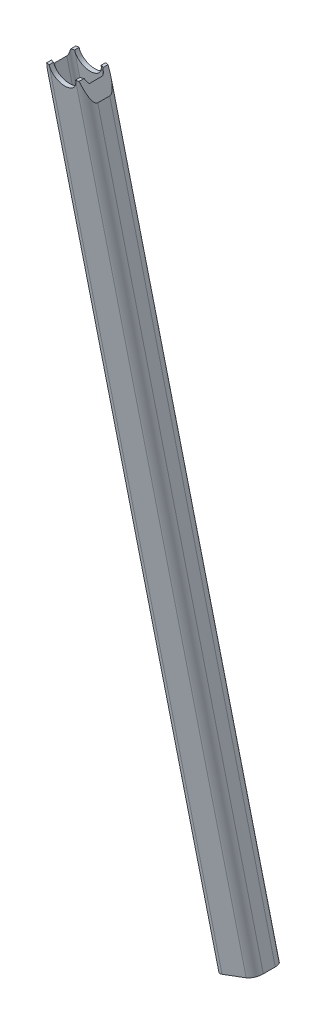
ISO-10303-21;
HEADER;
FILE_DESCRIPTION(('STEP AP214'),'2;1');
FILE_NAME('part.step','',(''),(''),'','','');
FILE_SCHEMA(('AUTOMOTIVE_DESIGN { 1 0 10303 214 1 1 1 1 }'));
ENDSEC;
DATA;
#1=APPLICATION_CONTEXT('core data for automotive mechanical design processes');
#2=APPLICATION_PROTOCOL_DEFINITION('international standard','automotive_design',2000,#1);
#3=PRODUCT_CONTEXT('',#1,'mechanical');
#4=PRODUCT('Part','Part','',(#3));
#5=PRODUCT_RELATED_PRODUCT_CATEGORY('part','',(#4));
#6=PRODUCT_DEFINITION_FORMATION('','',#4);
#7=PRODUCT_DEFINITION_CONTEXT('part definition',#1,'design');
#8=PRODUCT_DEFINITION('design','',#6,#7);
#9=PRODUCT_DEFINITION_SHAPE('','',#8);
#10=(LENGTH_UNIT() NAMED_UNIT(*) SI_UNIT(.MILLI.,.METRE.));
#11=(NAMED_UNIT(*) PLANE_ANGLE_UNIT() SI_UNIT($,.RADIAN.));
#12=(NAMED_UNIT(*) SI_UNIT($,.STERADIAN.) SOLID_ANGLE_UNIT());
#13=UNCERTAINTY_MEASURE_WITH_UNIT(LENGTH_MEASURE(1.E-05),#10,'distance_accuracy_value','');
#14=(GEOMETRIC_REPRESENTATION_CONTEXT(3) GLOBAL_UNCERTAINTY_ASSIGNED_CONTEXT((#13)) GLOBAL_UNIT_ASSIGNED_CONTEXT((#10,
#11,#12)) REPRESENTATION_CONTEXT('',''));
#15=CARTESIAN_POINT('',(0.,0.,0.));
#16=DIRECTION('',(0.,0.,1.));
#17=DIRECTION('',(1.,0.,0.));
#18=AXIS2_PLACEMENT_3D('',#15,#16,#17);
#19=CARTESIAN_POINT('',(0.,0.,0.));
#20=DIRECTION('',(0.,1.,0.));
#21=DIRECTION('',(0.,0.,-1.));
#22=AXIS2_PLACEMENT_3D('',#19,#20,#21);
#23=PLANE('',#22);
#24=CARTESIAN_POINT('',(9.,0.,-4.07747594806573));
#25=DIRECTION('',(0.,-1.,0.));
#26=DIRECTION('',(0.,0.,1.));
#27=AXIS2_PLACEMENT_3D('',#24,#25,#26);
#28=ELLIPSE('',#27,6.1162139220986,6.);
#29=CARTESIAN_POINT('',(8.99999999999999,0.,-10.1936898701643));
#30=VERTEX_POINT('',#29);
#31=CARTESIAN_POINT('',(10.980762113533,0.,-9.8507936254523));
#32=VERTEX_POINT('',#31);
#33=EDGE_CURVE('E214',#30,#32,#28,.T.);
#34=ORIENTED_EDGE('',*,*,#33,.F.);
#35=DIRECTION('',(0.,0.,-1.));
#36=VECTOR('',#35,1.);
#37=CARTESIAN_POINT('',(9.,0.,10.1936898701643));
#38=LINE('',#37,#36);
#39=CARTESIAN_POINT('',(9.00000000000003,0.,-7.13558290911504));
#40=VERTEX_POINT('',#39);
#41=EDGE_CURVE('E197',#30,#40,#38,.F.);
#42=ORIENTED_EDGE('',*,*,#41,.T.);
#43=CARTESIAN_POINT('',(9.,0.,-4.07747594806573));
#44=DIRECTION('',(0.,-1.,0.));
#45=DIRECTION('',(0.,0.,1.));
#46=AXIS2_PLACEMENT_3D('',#43,#44,#45);
#47=ELLIPSE('',#46,3.0581069610493,3.);
#48=CARTESIAN_POINT('',(10.980762113533,0.,-6.37424377446214));
#49=VERTEX_POINT('',#48);
#50=EDGE_CURVE('E202',#40,#49,#47,.T.);
#51=ORIENTED_EDGE('',*,*,#50,.T.);
#52=DIRECTION('',(0.,0.,1.));
#53=VECTOR('',#52,1.);
#54=CARTESIAN_POINT('',(10.980762113533,0.,0.));
#55=LINE('',#54,#53);
#56=EDGE_CURVE('E310',#32,#49,#55,.T.);
#57=ORIENTED_EDGE('',*,*,#56,.F.);
#58=EDGE_LOOP('',(#34,#42,#51,#57));
#59=FACE_BOUND('',#58,.T.);
#60=ADVANCED_FACE('F43',(#59),#23,.T.);
#61=CARTESIAN_POINT('',(-9.,0.,4.07747594806573));
#62=DIRECTION('',(0.,-1.,0.));
#63=DIRECTION('',(0.,0.,1.));
#64=AXIS2_PLACEMENT_3D('',#61,#62,#63);
#65=ELLIPSE('',#64,6.1162139220986,6.);
#66=CARTESIAN_POINT('',(-9.,0.,10.1936898701643));
#67=VERTEX_POINT('',#66);
#68=CARTESIAN_POINT('',(-10.980762113533,0.,9.8507936254523));
#69=VERTEX_POINT('',#68);
#70=EDGE_CURVE('E249',#67,#69,#65,.T.);
#71=ORIENTED_EDGE('',*,*,#70,.F.);
#72=DIRECTION('',(0.,0.,-1.));
#73=VECTOR('',#72,1.);
#74=CARTESIAN_POINT('',(-9.,0.,10.1936898701643));
#75=LINE('',#74,#73);
#76=CARTESIAN_POINT('',(-8.99999999999999,0.,7.13558290911504));
#77=VERTEX_POINT('',#76);
#78=EDGE_CURVE('E220',#67,#77,#75,.T.);
#79=ORIENTED_EDGE('',*,*,#78,.T.);
#80=CARTESIAN_POINT('',(-9.,0.,4.07747594806573));
#81=DIRECTION('',(0.,-1.,0.));
#82=DIRECTION('',(0.,0.,1.));
#83=AXIS2_PLACEMENT_3D('',#80,#81,#82);
#84=ELLIPSE('',#83,3.0581069610493,3.);
#85=CARTESIAN_POINT('',(-10.980762113533,0.,6.37424377446214));
#86=VERTEX_POINT('',#85);
#87=EDGE_CURVE('E323',#77,#86,#84,.T.);
#88=ORIENTED_EDGE('',*,*,#87,.T.);
#89=DIRECTION('',(0.,0.,-1.));
#90=VECTOR('',#89,1.);
#91=CARTESIAN_POINT('',(-10.980762113533,0.,0.));
#92=LINE('',#91,#90);
#93=EDGE_CURVE('E286',#69,#86,#92,.T.);
#94=ORIENTED_EDGE('',*,*,#93,.F.);
#95=EDGE_LOOP('',(#71,#79,#88,#94));
#96=FACE_BOUND('',#95,.T.);
#97=ADVANCED_FACE('F394',(#96),#23,.T.);
#98=CARTESIAN_POINT('',(0.,0.,10.1936898701643));
#99=DIRECTION('',(0.,0.,-1.));
#100=DIRECTION('',(1.,0.,0.));
#101=AXIS2_PLACEMENT_3D('',#98,#99,#100);
#102=CYLINDRICAL_SURFACE('',#101,9.);
#103=CARTESIAN_POINT('',(0.,0.,7.13558290911504));
#104=DIRECTION('',(0.,0.194012574418143,-0.980999042286813));
#105=DIRECTION('',(0.,-0.980999042286813,-0.194012574418143));
#106=AXIS2_PLACEMENT_3D('',#103,#104,#105);
#107=ELLIPSE('',#106,9.1743208831479,9.);
#108=CARTESIAN_POINT('',(9.,0.,7.13558290911504));
#109=VERTEX_POINT('',#108);
#110=EDGE_CURVE('E201',#109,#77,#107,.T.);
#111=ORIENTED_EDGE('',*,*,#110,.T.);
#112=ORIENTED_EDGE('',*,*,#78,.F.);
#113=CARTESIAN_POINT('',(0.,0.,10.1936898701643));
#114=DIRECTION('',(0.,0.194012574418143,-0.980999042286813));
#115=DIRECTION('',(0.,-0.980999042286813,-0.194012574418143));
#116=AXIS2_PLACEMENT_3D('',#113,#114,#115);
#117=ELLIPSE('',#116,9.1743208831479,9.);
#118=CARTESIAN_POINT('',(9.,0.,10.1936898701643));
#119=VERTEX_POINT('',#118);
#120=EDGE_CURVE('E186',#119,#67,#117,.T.);
#121=ORIENTED_EDGE('',*,*,#120,.F.);
#122=EDGE_CURVE('E212',#109,#119,#38,.F.);
#123=ORIENTED_EDGE('',*,*,#122,.F.);
#124=EDGE_LOOP('',(#111,#112,#121,#123));
#125=FACE_BOUND('',#124,.T.);
#126=ADVANCED_FACE('F388',(#125),#102,.F.);
#127=CARTESIAN_POINT('',(-9.,0.,-4.07747594806573));
#128=DIRECTION('',(0.,-1.,0.));
#129=DIRECTION('',(0.,0.,-1.));
#130=AXIS2_PLACEMENT_3D('',#127,#128,#129);
#131=ELLIPSE('',#130,3.0581069610493,3.);
#132=CARTESIAN_POINT('',(-10.980762113533,0.,-6.37424377446214));
#133=VERTEX_POINT('',#132);
#134=CARTESIAN_POINT('',(-9.,0.,-7.13558290911504));
#135=VERTEX_POINT('',#134);
#136=EDGE_CURVE('E213',#133,#135,#131,.T.);
#137=ORIENTED_EDGE('',*,*,#136,.T.);
#138=CARTESIAN_POINT('',(-8.99999999999995,0.,-10.1936898701643));
#139=VERTEX_POINT('',#138);
#140=EDGE_CURVE('E196',#135,#139,#75,.T.);
#141=ORIENTED_EDGE('',*,*,#140,.T.);
#142=CARTESIAN_POINT('',(-9.,0.,-4.07747594806573));
#143=DIRECTION('',(0.,-1.,0.));
#144=DIRECTION('',(0.,0.,-1.));
#145=AXIS2_PLACEMENT_3D('',#142,#143,#144);
#146=ELLIPSE('',#145,6.1162139220986,6.);
#147=CARTESIAN_POINT('',(-10.980762113533,0.,-9.8507936254523));
#148=VERTEX_POINT('',#147);
#149=EDGE_CURVE('E243',#148,#139,#146,.T.);
#150=ORIENTED_EDGE('',*,*,#149,.F.);
#151=DIRECTION('',(0.,0.,-1.));
#152=VECTOR('',#151,1.);
#153=CARTESIAN_POINT('',(-10.980762113533,0.,0.));
#154=LINE('',#153,#152);
#155=EDGE_CURVE('E281',#133,#148,#154,.T.);
#156=ORIENTED_EDGE('',*,*,#155,.F.);
#157=EDGE_LOOP('',(#137,#141,#150,#156));
#158=FACE_BOUND('',#157,.T.);
#159=ADVANCED_FACE('F369',(#158),#23,.T.);
#160=CARTESIAN_POINT('',(9.,0.,4.07747594806573));
#161=DIRECTION('',(0.,-1.,0.));
#162=DIRECTION('',(0.,0.,-1.));
#163=AXIS2_PLACEMENT_3D('',#160,#161,#162);
#164=ELLIPSE('',#163,3.0581069610493,3.);
#165=CARTESIAN_POINT('',(10.980762113533,0.,6.37424377446214));
#166=VERTEX_POINT('',#165);
#167=EDGE_CURVE('E208',#166,#109,#164,.T.);
#168=ORIENTED_EDGE('',*,*,#167,.T.);
#169=ORIENTED_EDGE('',*,*,#122,.T.);
#170=CARTESIAN_POINT('',(9.,0.,4.07747594806573));
#171=DIRECTION('',(0.,-1.,0.));
#172=DIRECTION('',(0.,0.,-1.));
#173=AXIS2_PLACEMENT_3D('',#170,#171,#172);
#174=ELLIPSE('',#173,6.1162139220986,6.);
#175=CARTESIAN_POINT('',(10.980762113533,0.,9.8507936254523));
#176=VERTEX_POINT('',#175);
#177=EDGE_CURVE('E250',#176,#119,#174,.T.);
#178=ORIENTED_EDGE('',*,*,#177,.F.);
#179=DIRECTION('',(0.,0.,1.));
#180=VECTOR('',#179,1.);
#181=CARTESIAN_POINT('',(10.980762113533,0.,0.));
#182=LINE('',#181,#180);
#183=EDGE_CURVE('E302',#166,#176,#182,.T.);
#184=ORIENTED_EDGE('',*,*,#183,.F.);
#185=EDGE_LOOP('',(#168,#169,#178,#184));
#186=FACE_BOUND('',#185,.T.);
#187=ADVANCED_FACE('F317',(#186),#23,.T.);
#188=CARTESIAN_POINT('',(-15.,21.5601065899177,-5.92973893450527));
#189=DIRECTION('',(-1.,0.,0.));
#190=DIRECTION('',(0.,0.,-1.));
#191=AXIS2_PLACEMENT_3D('',#188,#189,#190);
#192=PLANE('',#191);
#193=DIRECTION('',(0.,0.980999042286813,0.194012574418143));
#194=VECTOR('',#193,1.);
#195=CARTESIAN_POINT('',(-15.,-1.16407544650886,-4.30769561644346));
#196=LINE('',#195,#194);
#197=CARTESIAN_POINT('',(-15.,-597.146812792209,-122.175440840404));
#198=VERTEX_POINT('',#197);
#199=CARTESIAN_POINT('',(-15.,-15.,-7.04403196986183));
#200=VERTEX_POINT('',#199);
#201=EDGE_CURVE('E254',#198,#200,#196,.T.);
#202=ORIENTED_EDGE('',*,*,#201,.F.);
#203=DIRECTION('',(0.,0.,1.));
#204=VECTOR('',#203,1.);
#205=CARTESIAN_POINT('',(-15.,-597.146812792209,-5.92973893450527));
#206=LINE('',#205,#204);
#207=CARTESIAN_POINT('',(-15.,-597.146812792209,-114.020488944272));
#208=VERTEX_POINT('',#207);
#209=EDGE_CURVE('E230',#198,#208,#206,.T.);
#210=ORIENTED_EDGE('',*,*,#209,.T.);
#211=DIRECTION('',(0.,0.980999042286813,0.194012574418143));
#212=VECTOR('',#211,1.);
#213=CARTESIAN_POINT('',(-15.,18.8439305480637,7.80424765751012));
#214=LINE('',#213,#212);
#215=CARTESIAN_POINT('',(-15.,-15.,1.11091992626965));
#216=VERTEX_POINT('',#215);
#217=EDGE_CURVE('E258',#216,#208,#214,.F.);
#218=ORIENTED_EDGE('',*,*,#217,.F.);
#219=DIRECTION('',(0.,0.,1.));
#220=VECTOR('',#219,1.);
#221=CARTESIAN_POINT('',(-15.,-15.,-5.92973893450527));
#222=LINE('',#221,#220);
#223=EDGE_CURVE('E279',#200,#216,#222,.T.);
#224=ORIENTED_EDGE('',*,*,#223,.F.);
#225=EDGE_LOOP('',(#202,#210,#218,#224));
#226=FACE_BOUND('',#225,.T.);
#227=ADVANCED_FACE('F437',(#226),#192,.T.);
#228=CARTESIAN_POINT('',(15.,21.5601065899177,-5.92973893450527));
#229=DIRECTION('',(1.,0.,0.));
#230=DIRECTION('',(0.,0.,1.));
#231=AXIS2_PLACEMENT_3D('',#228,#229,#230);
#232=PLANE('',#231);
#233=DIRECTION('',(0.,-0.980999042286813,-0.194012574418143));
#234=VECTOR('',#233,1.);
#235=CARTESIAN_POINT('',(15.,18.8439305480637,7.80424765751011));
#236=LINE('',#235,#234);
#237=CARTESIAN_POINT('',(15.,-584.412568305921,-111.502032300018));
#238=VERTEX_POINT('',#237);
#239=CARTESIAN_POINT('',(15.,-15.,1.11091992626964));
#240=VERTEX_POINT('',#239);
#241=EDGE_CURVE('E267',#238,#240,#236,.F.);
#242=ORIENTED_EDGE('',*,*,#241,.F.);
#243=DIRECTION('',(0.,0.,-1.));
#244=VECTOR('',#243,1.);
#245=CARTESIAN_POINT('',(15.,-584.412568305921,-5.92973893450527));
#246=LINE('',#245,#244);
#247=CARTESIAN_POINT('',(15.,-584.412568305921,-119.656984196149));
#248=VERTEX_POINT('',#247);
#249=EDGE_CURVE('E228',#238,#248,#246,.T.);
#250=ORIENTED_EDGE('',*,*,#249,.T.);
#251=DIRECTION('',(0.,-0.980999042286813,-0.194012574418143));
#252=VECTOR('',#251,1.);
#253=CARTESIAN_POINT('',(15.,-585.576643752429,-119.887203864527));
#254=LINE('',#253,#252);
#255=CARTESIAN_POINT('',(15.,-15.,-7.04403196986182));
#256=VERTEX_POINT('',#255);
#257=EDGE_CURVE('E266',#256,#248,#254,.T.);
#258=ORIENTED_EDGE('',*,*,#257,.F.);
#259=DIRECTION('',(0.,0.,-1.));
#260=VECTOR('',#259,1.);
#261=CARTESIAN_POINT('',(15.,-15.,-5.92973893450527));
#262=LINE('',#261,#260);
#263=EDGE_CURVE('E299',#240,#256,#262,.T.);
#264=ORIENTED_EDGE('',*,*,#263,.F.);
#265=EDGE_LOOP('',(#242,#250,#258,#264));
#266=FACE_BOUND('',#265,.T.);
#267=ADVANCED_FACE('F410',(#266),#232,.T.);
#268=CARTESIAN_POINT('',(0.,1.94012574418143,-9.80999042286813));
#269=DIRECTION('',(0.,-0.194012574418143,0.980999042286813));
#270=DIRECTION('',(0.,0.980999042286813,0.194012574418143));
#271=AXIS2_PLACEMENT_3D('',#268,#269,#270);
#272=PLANE('',#271);
#273=DIRECTION('',(0.,-0.980999042286813,-0.194012574418143));
#274=VECTOR('',#273,1.);
#275=CARTESIAN_POINT('',(9.,0.,-10.1936898701643));
#276=LINE('',#275,#274);
#277=CARTESIAN_POINT('',(9.00000000000006,-586.959417203178,-126.276889447099));
#278=VERTEX_POINT('',#277);
#279=EDGE_CURVE('E278',#278,#30,#276,.F.);
#280=ORIENTED_EDGE('',*,*,#279,.F.);
#281=DIRECTION('',(0.917768734443844,0.389569714875973,0.0770453589049803));
#282=VECTOR('',#281,1.);
#283=CARTESIAN_POINT('',(220.206800266404,-497.307449477877,-108.546383799008));
#284=LINE('',#283,#282);
#285=CARTESIAN_POINT('',(-8.99999999999995,-594.599963894951,-127.787963433651));
#286=VERTEX_POINT('',#285);
#287=EDGE_CURVE('E235',#286,#278,#284,.T.);
#288=ORIENTED_EDGE('',*,*,#287,.F.);
#289=DIRECTION('',(0.,0.980999042286813,0.194012574418143));
#290=VECTOR('',#289,1.);
#291=CARTESIAN_POINT('',(-9.,-597.146812792209,-128.291654762502));
#292=LINE('',#291,#290);
#293=EDGE_CURVE('E271',#139,#286,#292,.F.);
#294=ORIENTED_EDGE('',*,*,#293,.F.);
#295=CARTESIAN_POINT('',(0.,0.,-10.1936898701643));
#296=DIRECTION('',(0.,0.194012574418143,-0.980999042286813));
#297=DIRECTION('',(0.,-0.980999042286813,-0.194012574418143));
#298=AXIS2_PLACEMENT_3D('',#295,#296,#297);
#299=ELLIPSE('',#298,9.1743208831479,9.);
#300=EDGE_CURVE('E223',#30,#139,#299,.T.);
#301=ORIENTED_EDGE('',*,*,#300,.F.);
#302=EDGE_LOOP('',(#280,#288,#294,#301));
#303=FACE_BOUND('',#302,.T.);
#304=ADVANCED_FACE('F411',(#303),#272,.F.);
#305=CARTESIAN_POINT('',(0.,-1.94012574418143,9.80999042286813));
#306=DIRECTION('',(0.,-0.194012574418143,0.980999042286813));
#307=DIRECTION('',(0.,0.980999042286813,0.194012574418143));
#308=AXIS2_PLACEMENT_3D('',#305,#306,#307);
#309=PLANE('',#308);
#310=ORIENTED_EDGE('',*,*,#120,.T.);
#311=DIRECTION('',(0.,0.980999042286813,0.194012574418143));
#312=VECTOR('',#311,1.);
#313=CARTESIAN_POINT('',(-9.,-1.94012574418143,9.80999042286813));
#314=LINE('',#313,#312);
#315=CARTESIAN_POINT('',(-8.99999999999998,-594.599963894951,-107.400583693323));
#316=VERTEX_POINT('',#315);
#317=EDGE_CURVE('E241',#316,#67,#314,.T.);
#318=ORIENTED_EDGE('',*,*,#317,.F.);
#319=DIRECTION('',(0.917768734443844,0.389569714875973,0.0770453589049803));
#320=VECTOR('',#319,1.);
#321=CARTESIAN_POINT('',(218.765212283359,-497.919367272031,-88.2800232864852));
#322=LINE('',#321,#320);
#323=CARTESIAN_POINT('',(9.00000000000006,-586.959417203178,-105.88950970677));
#324=VERTEX_POINT('',#323);
#325=EDGE_CURVE('E232',#316,#324,#322,.T.);
#326=ORIENTED_EDGE('',*,*,#325,.T.);
#327=DIRECTION('',(0.,-0.980999042286813,-0.194012574418143));
#328=VECTOR('',#327,1.);
#329=CARTESIAN_POINT('',(9.,-1.94012574418143,9.80999042286813));
#330=LINE('',#329,#328);
#331=EDGE_CURVE('E238',#119,#324,#330,.T.);
#332=ORIENTED_EDGE('',*,*,#331,.F.);
#333=EDGE_LOOP('',(#310,#318,#326,#332));
#334=FACE_BOUND('',#333,.T.);
#335=ADVANCED_FACE('F397',(#334),#309,.T.);
#336=CARTESIAN_POINT('',(212.485672321848,-500.584873843074,0.));
#337=DIRECTION('',(-0.390731128489275,0.92050485345244,0.));
#338=DIRECTION('',(-0.92050485345244,-0.390731128489275,0.));
#339=AXIS2_PLACEMENT_3D('',#336,#337,#338);
#340=PLANE('',#339);
#341=DIRECTION('',(0.,0.,1.));
#342=VECTOR('',#341,1.);
#343=CARTESIAN_POINT('',(-12.,-595.87338834358,-5.92973893450527));
#344=LINE('',#343,#342);
#345=CARTESIAN_POINT('',(-12.,-595.87338834358,-121.923595175978));
#346=VERTEX_POINT('',#345);
#347=CARTESIAN_POINT('',(-12.,-595.87338834358,-113.768643279847));
#348=VERTEX_POINT('',#347);
#349=EDGE_CURVE('E326',#346,#348,#344,.T.);
#350=ORIENTED_EDGE('',*,*,#349,.T.);
#351=CARTESIAN_POINT('',(-9.,-594.599963894951,-113.516797615421));
#352=DIRECTION('',(0.390731128489275,-0.92050485345244,0.));
#353=DIRECTION('',(0.821292711636287,0.348618072826102,0.4516012855519));
#354=AXIS2_PLACEMENT_3D('',#351,#352,#353);
#355=ELLIPSE('',#354,3.32220623235128,3.);
#356=CARTESIAN_POINT('',(-8.99999999999998,-594.599963894951,-110.458690654372));
#357=VERTEX_POINT('',#356);
#358=EDGE_CURVE('E331',#348,#357,#355,.F.);
#359=ORIENTED_EDGE('',*,*,#358,.T.);
#360=DIRECTION('',(0.917768734443844,0.389569714875973,0.0770453589049803));
#361=VECTOR('',#360,1.);
#362=CARTESIAN_POINT('',(218.981450480816,-497.827579602908,-91.3199773633636));
#363=LINE('',#362,#361);
#364=CARTESIAN_POINT('',(9.,-586.959417203178,-108.947616667819));
#365=VERTEX_POINT('',#364);
#366=EDGE_CURVE('E340',#357,#365,#363,.T.);
#367=ORIENTED_EDGE('',*,*,#366,.T.);
#368=CARTESIAN_POINT('',(9.,-586.959417203178,-112.005723628868));
#369=DIRECTION('',(0.390731128489275,-0.92050485345244,0.));
#370=DIRECTION('',(-0.821292711636287,-0.348618072826102,-0.4516012855519));
#371=AXIS2_PLACEMENT_3D('',#368,#369,#370);
#372=ELLIPSE('',#371,3.32220623235128,3.);
#373=CARTESIAN_POINT('',(12.,-585.685992754549,-111.753877964443));
#374=VERTEX_POINT('',#373);
#375=EDGE_CURVE('E337',#365,#374,#372,.F.);
#376=ORIENTED_EDGE('',*,*,#375,.T.);
#377=DIRECTION('',(0.,0.,-1.));
#378=VECTOR('',#377,1.);
#379=CARTESIAN_POINT('',(12.,-585.685992754549,-5.92973893450527));
#380=LINE('',#379,#378);
#381=CARTESIAN_POINT('',(12.,-585.685992754549,-119.908829860574));
#382=VERTEX_POINT('',#381);
#383=EDGE_CURVE('E204',#374,#382,#380,.T.);
#384=ORIENTED_EDGE('',*,*,#383,.T.);
#385=CARTESIAN_POINT('',(9.,-586.959417203178,-120.160675525));
#386=DIRECTION('',(0.390731128489275,-0.92050485345244,0.));
#387=DIRECTION('',(0.821292711636287,0.348618072826102,0.4516012855519));
#388=AXIS2_PLACEMENT_3D('',#385,#386,#387);
#389=ELLIPSE('',#388,3.32220623235128,3.);
#390=CARTESIAN_POINT('',(9.00000000000006,-586.959417203178,-123.218782486049));
#391=VERTEX_POINT('',#390);
#392=EDGE_CURVE('E345',#382,#391,#389,.F.);
#393=ORIENTED_EDGE('',*,*,#392,.T.);
#394=DIRECTION('',(0.917768734443844,0.389569714875973,0.0770453589049803));
#395=VECTOR('',#394,1.);
#396=CARTESIAN_POINT('',(219.990562068948,-497.399237147,-105.506429722129));
#397=LINE('',#396,#395);
#398=CARTESIAN_POINT('',(-8.99999999999995,-594.599963894951,-124.729856472602));
#399=VERTEX_POINT('',#398);
#400=EDGE_CURVE('E183',#399,#391,#397,.T.);
#401=ORIENTED_EDGE('',*,*,#400,.F.);
#402=CARTESIAN_POINT('',(-9.,-594.599963894951,-121.671749511553));
#403=DIRECTION('',(0.390731128489275,-0.92050485345244,0.));
#404=DIRECTION('',(-0.821292711636287,-0.348618072826102,-0.4516012855519));
#405=AXIS2_PLACEMENT_3D('',#402,#403,#404);
#406=ELLIPSE('',#405,3.32220623235128,3.);
#407=EDGE_CURVE('E347',#399,#346,#406,.F.);
#408=ORIENTED_EDGE('',*,*,#407,.T.);
#409=EDGE_LOOP('',(#350,#359,#367,#376,#384,#393,#401,#408));
#410=FACE_BOUND('',#409,.T.);
#411=ORIENTED_EDGE('',*,*,#209,.F.);
#412=CARTESIAN_POINT('',(-9.,-594.599963894951,-121.671749511553));
#413=DIRECTION('',(0.390731128489275,-0.92050485345244,0.));
#414=DIRECTION('',(-0.821292711636287,-0.348618072826102,-0.4516012855519));
#415=AXIS2_PLACEMENT_3D('',#412,#413,#414);
#416=ELLIPSE('',#415,6.64441246470257,6.);
#417=EDGE_CURVE('E259',#286,#198,#416,.F.);
#418=ORIENTED_EDGE('',*,*,#417,.F.);
#419=ORIENTED_EDGE('',*,*,#287,.T.);
#420=CARTESIAN_POINT('',(9.,-586.959417203178,-120.160675525));
#421=DIRECTION('',(0.390731128489275,-0.92050485345244,0.));
#422=DIRECTION('',(0.821292711636287,0.348618072826102,0.4516012855519));
#423=AXIS2_PLACEMENT_3D('',#420,#421,#422);
#424=ELLIPSE('',#423,6.64441246470257,6.);
#425=EDGE_CURVE('E262',#248,#278,#424,.F.);
#426=ORIENTED_EDGE('',*,*,#425,.F.);
#427=ORIENTED_EDGE('',*,*,#249,.F.);
#428=CARTESIAN_POINT('',(9.,-586.959417203178,-112.005723628868));
#429=DIRECTION('',(0.390731128489275,-0.92050485345244,0.));
#430=DIRECTION('',(-0.821292711636287,-0.348618072826102,-0.4516012855519));
#431=AXIS2_PLACEMENT_3D('',#428,#429,#430);
#432=ELLIPSE('',#431,6.64441246470257,6.);
#433=EDGE_CURVE('E264',#324,#238,#432,.F.);
#434=ORIENTED_EDGE('',*,*,#433,.F.);
#435=ORIENTED_EDGE('',*,*,#325,.F.);
#436=CARTESIAN_POINT('',(-9.,-594.599963894951,-113.516797615421));
#437=DIRECTION('',(0.390731128489275,-0.92050485345244,0.));
#438=DIRECTION('',(0.821292711636287,0.348618072826102,0.4516012855519));
#439=AXIS2_PLACEMENT_3D('',#436,#437,#438);
#440=ELLIPSE('',#439,6.64441246470257,6.);
#441=EDGE_CURVE('E263',#208,#316,#440,.F.);
#442=ORIENTED_EDGE('',*,*,#441,.F.);
#443=EDGE_LOOP('',(#411,#418,#419,#426,#427,#434,#435,#442));
#444=FACE_BOUND('',#443,.T.);
#445=ADVANCED_FACE('F372',(#410,#444),#340,.F.);
#446=CARTESIAN_POINT('',(-9.,-0.776050297672572,3.92399616914725));
#447=DIRECTION('',(0.,0.980999042286813,0.194012574418143));
#448=DIRECTION('',(0.,0.194012574418143,-0.980999042286813));
#449=AXIS2_PLACEMENT_3D('',#446,#447,#448);
#450=CYLINDRICAL_SURFACE('',#449,6.);
#451=ORIENTED_EDGE('',*,*,#217,.T.);
#452=ORIENTED_EDGE('',*,*,#441,.T.);
#453=ORIENTED_EDGE('',*,*,#317,.T.);
#454=ORIENTED_EDGE('',*,*,#70,.T.);
#455=CARTESIAN_POINT('',(-9.,7.39230484541259,5.53945504500648));
#456=DIRECTION('',(-0.965925826289066,0.258819045102528,0.));
#457=DIRECTION('',(0.253558845971762,0.94629449587512,0.200585739039248));
#458=AXIS2_PLACEMENT_3D('',#455,#456,#457);
#459=ELLIPSE('',#458,23.6312359458545,6.);
#460=EDGE_CURVE('E285',#216,#69,#459,.T.);
#461=ORIENTED_EDGE('',*,*,#460,.F.);
#462=EDGE_LOOP('',(#451,#452,#453,#454,#461));
#463=FACE_BOUND('',#462,.T.);
#464=ADVANCED_FACE('F393',(#463),#450,.T.);
#465=CARTESIAN_POINT('',(9.,-0.776050297672572,3.92399616914725));
#466=DIRECTION('',(0.,-0.980999042286813,-0.194012574418143));
#467=DIRECTION('',(0.,-0.194012574418143,0.980999042286813));
#468=AXIS2_PLACEMENT_3D('',#465,#466,#467);
#469=CYLINDRICAL_SURFACE('',#468,6.);
#470=ORIENTED_EDGE('',*,*,#177,.T.);
#471=ORIENTED_EDGE('',*,*,#331,.T.);
#472=ORIENTED_EDGE('',*,*,#433,.T.);
#473=ORIENTED_EDGE('',*,*,#241,.T.);
#474=CARTESIAN_POINT('',(9.,7.39230484541259,5.53945504500648));
#475=DIRECTION('',(0.965925826289066,0.258819045102528,0.));
#476=DIRECTION('',(0.253558845971762,-0.94629449587512,-0.200585739039248));
#477=AXIS2_PLACEMENT_3D('',#474,#475,#476);
#478=ELLIPSE('',#477,23.6312359458545,6.);
#479=EDGE_CURVE('E11',#176,#240,#478,.T.);
#480=ORIENTED_EDGE('',*,*,#479,.F.);
#481=EDGE_LOOP('',(#470,#471,#472,#473,#480));
#482=FACE_BOUND('',#481,.T.);
#483=ADVANCED_FACE('F405',(#482),#469,.T.);
#484=CARTESIAN_POINT('',(9.,20.3960311434088,-0.0437446807843925));
#485=DIRECTION('',(0.,0.980999042286813,0.194012574418143));
#486=DIRECTION('',(0.,0.194012574418143,-0.980999042286813));
#487=AXIS2_PLACEMENT_3D('',#484,#485,#486);
#488=CYLINDRICAL_SURFACE('',#487,6.);
#489=ORIENTED_EDGE('',*,*,#257,.T.);
#490=ORIENTED_EDGE('',*,*,#425,.T.);
#491=ORIENTED_EDGE('',*,*,#279,.T.);
#492=ORIENTED_EDGE('',*,*,#33,.T.);
#493=CARTESIAN_POINT('',(9.,7.39230484541259,-2.61549685112499));
#494=DIRECTION('',(0.965925826289066,0.258819045102528,0.));
#495=DIRECTION('',(-0.253558845971762,0.94629449587512,0.200585739039248));
#496=AXIS2_PLACEMENT_3D('',#493,#494,#495);
#497=ELLIPSE('',#496,23.6312359458545,6.);
#498=EDGE_CURVE('E305',#256,#32,#497,.T.);
#499=ORIENTED_EDGE('',*,*,#498,.F.);
#500=EDGE_LOOP('',(#489,#490,#491,#492,#499));
#501=FACE_BOUND('',#500,.T.);
#502=ADVANCED_FACE('F407',(#501),#488,.T.);
#503=CARTESIAN_POINT('',(-9.,20.3960311434088,-0.0437446807843925));
#504=DIRECTION('',(0.,-0.980999042286813,-0.194012574418143));
#505=DIRECTION('',(0.,-0.194012574418143,0.980999042286813));
#506=AXIS2_PLACEMENT_3D('',#503,#504,#505);
#507=CYLINDRICAL_SURFACE('',#506,6.);
#508=ORIENTED_EDGE('',*,*,#149,.T.);
#509=ORIENTED_EDGE('',*,*,#293,.T.);
#510=ORIENTED_EDGE('',*,*,#417,.T.);
#511=ORIENTED_EDGE('',*,*,#201,.T.);
#512=CARTESIAN_POINT('',(-9.,7.39230484541259,-2.61549685112499));
#513=DIRECTION('',(-0.965925826289066,0.258819045102528,0.));
#514=DIRECTION('',(-0.253558845971762,-0.94629449587512,-0.200585739039248));
#515=AXIS2_PLACEMENT_3D('',#512,#513,#514);
#516=ELLIPSE('',#515,23.6312359458545,6.);
#517=EDGE_CURVE('E300',#148,#200,#516,.T.);
#518=ORIENTED_EDGE('',*,*,#517,.F.);
#519=EDGE_LOOP('',(#508,#509,#510,#511,#518));
#520=FACE_BOUND('',#519,.T.);
#521=ADVANCED_FACE('F416',(#520),#507,.T.);
#522=ORIENTED_EDGE('',*,*,#41,.F.);
#523=ORIENTED_EDGE('',*,*,#300,.T.);
#524=ORIENTED_EDGE('',*,*,#140,.F.);
#525=CARTESIAN_POINT('',(0.,0.,-7.13558290911504));
#526=DIRECTION('',(0.,0.194012574418143,-0.980999042286813));
#527=DIRECTION('',(0.,-0.980999042286813,-0.194012574418143));
#528=AXIS2_PLACEMENT_3D('',#525,#526,#527);
#529=ELLIPSE('',#528,9.1743208831479,9.);
#530=EDGE_CURVE('E181',#40,#135,#529,.T.);
#531=ORIENTED_EDGE('',*,*,#530,.F.);
#532=EDGE_LOOP('',(#522,#523,#524,#531));
#533=FACE_BOUND('',#532,.T.);
#534=ADVANCED_FACE('F194',(#533),#102,.F.);
#535=CARTESIAN_POINT('',(-12.,21.5601065899177,-5.92973893450527));
#536=DIRECTION('',(-1.,0.,0.));
#537=DIRECTION('',(0.,0.,-1.));
#538=AXIS2_PLACEMENT_3D('',#535,#536,#537);
#539=PLANE('',#538);
#540=DIRECTION('',(0.,0.980999042286813,0.194012574418143));
#541=VECTOR('',#540,1.);
#542=CARTESIAN_POINT('',(-12.,-0.776050297672573,3.92399616914726));
#543=LINE('',#542,#541);
#544=CARTESIAN_POINT('',(-12.,-3.80384757729372,3.32518748563806));
#545=VERTEX_POINT('',#544);
#546=EDGE_CURVE('E349',#545,#348,#543,.F.);
#547=ORIENTED_EDGE('',*,*,#546,.T.);
#548=ORIENTED_EDGE('',*,*,#349,.F.);
#549=DIRECTION('',(0.,-0.980999042286813,-0.194012574418143));
#550=VECTOR('',#549,1.);
#551=CARTESIAN_POINT('',(-12.,20.3960311434088,-0.043744680784393));
#552=LINE('',#551,#550);
#553=CARTESIAN_POINT('',(-12.,-3.80384757729372,-4.82976441049341));
#554=VERTEX_POINT('',#553);
#555=EDGE_CURVE('E324',#346,#554,#552,.F.);
#556=ORIENTED_EDGE('',*,*,#555,.T.);
#557=DIRECTION('',(0.,0.,1.));
#558=VECTOR('',#557,1.);
#559=CARTESIAN_POINT('',(-12.,-3.80384757729372,-5.92973893450527));
#560=LINE('',#559,#558);
#561=EDGE_CURVE('E292',#545,#554,#560,.F.);
#562=ORIENTED_EDGE('',*,*,#561,.F.);
#563=EDGE_LOOP('',(#547,#548,#556,#562));
#564=FACE_BOUND('',#563,.T.);
#565=ADVANCED_FACE('F422',(#564),#539,.F.);
#566=CARTESIAN_POINT('',(12.,21.5601065899177,-5.92973893450527));
#567=DIRECTION('',(1.,0.,0.));
#568=DIRECTION('',(0.,0.,1.));
#569=AXIS2_PLACEMENT_3D('',#566,#567,#568);
#570=PLANE('',#569);
#571=DIRECTION('',(0.,0.980999042286813,0.194012574418143));
#572=VECTOR('',#571,1.);
#573=CARTESIAN_POINT('',(12.,20.3960311434088,-0.0437446807843894));
#574=LINE('',#573,#572);
#575=CARTESIAN_POINT('',(12.,-3.80384757729372,-4.82976441049341));
#576=VERTEX_POINT('',#575);
#577=EDGE_CURVE('E332',#576,#382,#574,.F.);
#578=ORIENTED_EDGE('',*,*,#577,.T.);
#579=ORIENTED_EDGE('',*,*,#383,.F.);
#580=DIRECTION('',(0.,-0.980999042286813,-0.194012574418143));
#581=VECTOR('',#580,1.);
#582=CARTESIAN_POINT('',(12.,-0.776050297672572,3.92399616914725));
#583=LINE('',#582,#581);
#584=CARTESIAN_POINT('',(12.,-3.80384757729372,3.32518748563805));
#585=VERTEX_POINT('',#584);
#586=EDGE_CURVE('E361',#374,#585,#583,.F.);
#587=ORIENTED_EDGE('',*,*,#586,.T.);
#588=DIRECTION('',(0.,0.,-1.));
#589=VECTOR('',#588,1.);
#590=CARTESIAN_POINT('',(12.,-3.80384757729372,-5.92973893450527));
#591=LINE('',#590,#589);
#592=EDGE_CURVE('E309',#576,#585,#591,.F.);
#593=ORIENTED_EDGE('',*,*,#592,.F.);
#594=EDGE_LOOP('',(#578,#579,#587,#593));
#595=FACE_BOUND('',#594,.T.);
#596=ADVANCED_FACE('F377',(#595),#570,.F.);
#597=CARTESIAN_POINT('',(0.,1.358088020927,-6.86699329600769));
#598=DIRECTION('',(0.,-0.194012574418143,0.980999042286813));
#599=DIRECTION('',(0.,0.980999042286813,0.194012574418143));
#600=AXIS2_PLACEMENT_3D('',#597,#598,#599);
#601=PLANE('',#600);
#602=DIRECTION('',(0.,0.980999042286813,0.194012574418143));
#603=VECTOR('',#602,1.);
#604=CARTESIAN_POINT('',(9.00000000000006,1.358088020927,-6.86699329600769));
#605=LINE('',#604,#603);
#606=EDGE_CURVE('E178',#391,#40,#605,.T.);
#607=ORIENTED_EDGE('',*,*,#606,.T.);
#608=ORIENTED_EDGE('',*,*,#530,.T.);
#609=DIRECTION('',(0.,0.980999042286813,0.194012574418143));
#610=VECTOR('',#609,1.);
#611=CARTESIAN_POINT('',(-8.99999999999995,1.358088020927,-6.86699329600769));
#612=LINE('',#611,#610);
#613=EDGE_CURVE('E188',#135,#399,#612,.F.);
#614=ORIENTED_EDGE('',*,*,#613,.T.);
#615=ORIENTED_EDGE('',*,*,#400,.T.);
#616=EDGE_LOOP('',(#607,#608,#614,#615));
#617=FACE_BOUND('',#616,.T.);
#618=ADVANCED_FACE('F179',(#617),#601,.T.);
#619=CARTESIAN_POINT('',(0.,-1.358088020927,6.86699329600769));
#620=DIRECTION('',(0.,-0.194012574418143,0.980999042286813));
#621=DIRECTION('',(0.,0.980999042286813,0.194012574418143));
#622=AXIS2_PLACEMENT_3D('',#619,#620,#621);
#623=PLANE('',#622);
#624=ORIENTED_EDGE('',*,*,#110,.F.);
#625=DIRECTION('',(0.,0.980999042286813,0.194012574418143));
#626=VECTOR('',#625,1.);
#627=CARTESIAN_POINT('',(9.,-1.358088020927,6.86699329600769));
#628=LINE('',#627,#626);
#629=EDGE_CURVE('E318',#109,#365,#628,.F.);
#630=ORIENTED_EDGE('',*,*,#629,.T.);
#631=ORIENTED_EDGE('',*,*,#366,.F.);
#632=DIRECTION('',(0.,0.980999042286813,0.194012574418143));
#633=VECTOR('',#632,1.);
#634=CARTESIAN_POINT('',(-8.99999999999998,-1.358088020927,6.86699329600769));
#635=LINE('',#634,#633);
#636=EDGE_CURVE('E359',#357,#77,#635,.T.);
#637=ORIENTED_EDGE('',*,*,#636,.T.);
#638=EDGE_LOOP('',(#624,#630,#631,#637));
#639=FACE_BOUND('',#638,.T.);
#640=ADVANCED_FACE('F385',(#639),#623,.F.);
#641=CARTESIAN_POINT('',(-9.,-0.776050297672572,3.92399616914725));
#642=DIRECTION('',(0.,0.980999042286813,0.194012574418143));
#643=DIRECTION('',(0.,0.194012574418143,-0.980999042286813));
#644=AXIS2_PLACEMENT_3D('',#641,#642,#643);
#645=CYLINDRICAL_SURFACE('',#644,3.);
#646=ORIENTED_EDGE('',*,*,#87,.F.);
#647=ORIENTED_EDGE('',*,*,#636,.F.);
#648=ORIENTED_EDGE('',*,*,#358,.F.);
#649=ORIENTED_EDGE('',*,*,#546,.F.);
#650=CARTESIAN_POINT('',(-9.,7.39230484541259,5.53945504500648));
#651=DIRECTION('',(-0.965925826289066,0.258819045102528,0.));
#652=DIRECTION('',(0.253558845971762,0.94629449587512,0.200585739039248));
#653=AXIS2_PLACEMENT_3D('',#650,#651,#652);
#654=ELLIPSE('',#653,11.8156179729273,3.);
#655=EDGE_CURVE('E287',#86,#545,#654,.F.);
#656=ORIENTED_EDGE('',*,*,#655,.F.);
#657=EDGE_LOOP('',(#646,#647,#648,#649,#656));
#658=FACE_BOUND('',#657,.T.);
#659=ADVANCED_FACE('F387',(#658),#645,.F.);
#660=CARTESIAN_POINT('',(9.,-0.776050297672572,3.92399616914725));
#661=DIRECTION('',(0.,-0.980999042286813,-0.194012574418143));
#662=DIRECTION('',(0.,-0.194012574418143,0.980999042286813));
#663=AXIS2_PLACEMENT_3D('',#660,#661,#662);
#664=CYLINDRICAL_SURFACE('',#663,3.);
#665=ORIENTED_EDGE('',*,*,#586,.F.);
#666=ORIENTED_EDGE('',*,*,#375,.F.);
#667=ORIENTED_EDGE('',*,*,#629,.F.);
#668=ORIENTED_EDGE('',*,*,#167,.F.);
#669=CARTESIAN_POINT('',(9.,7.39230484541259,5.53945504500648));
#670=DIRECTION('',(0.965925826289066,0.258819045102528,0.));
#671=DIRECTION('',(0.253558845971762,-0.94629449587512,-0.200585739039248));
#672=AXIS2_PLACEMENT_3D('',#669,#670,#671);
#673=ELLIPSE('',#672,11.8156179729273,3.);
#674=EDGE_CURVE('E51',#585,#166,#673,.F.);
#675=ORIENTED_EDGE('',*,*,#674,.F.);
#676=EDGE_LOOP('',(#665,#666,#667,#668,#675));
#677=FACE_BOUND('',#676,.T.);
#678=ADVANCED_FACE('F319',(#677),#664,.F.);
#679=CARTESIAN_POINT('',(9.,20.3960311434088,-0.0437446807843925));
#680=DIRECTION('',(0.,0.980999042286813,0.194012574418143));
#681=DIRECTION('',(0.,0.194012574418143,-0.980999042286813));
#682=AXIS2_PLACEMENT_3D('',#679,#680,#681);
#683=CYLINDRICAL_SURFACE('',#682,3.);
#684=ORIENTED_EDGE('',*,*,#50,.F.);
#685=ORIENTED_EDGE('',*,*,#606,.F.);
#686=ORIENTED_EDGE('',*,*,#392,.F.);
#687=ORIENTED_EDGE('',*,*,#577,.F.);
#688=CARTESIAN_POINT('',(9.,7.39230484541259,-2.61549685112499));
#689=DIRECTION('',(0.965925826289066,0.258819045102528,0.));
#690=DIRECTION('',(-0.253558845971762,0.94629449587512,0.200585739039248));
#691=AXIS2_PLACEMENT_3D('',#688,#689,#690);
#692=ELLIPSE('',#691,11.8156179729273,3.);
#693=EDGE_CURVE('E64',#49,#576,#692,.F.);
#694=ORIENTED_EDGE('',*,*,#693,.F.);
#695=EDGE_LOOP('',(#684,#685,#686,#687,#694));
#696=FACE_BOUND('',#695,.T.);
#697=ADVANCED_FACE('F207',(#696),#683,.F.);
#698=CARTESIAN_POINT('',(-9.,20.3960311434088,-0.0437446807843925));
#699=DIRECTION('',(0.,-0.980999042286813,-0.194012574418143));
#700=DIRECTION('',(0.,-0.194012574418143,0.980999042286813));
#701=AXIS2_PLACEMENT_3D('',#698,#699,#700);
#702=CYLINDRICAL_SURFACE('',#701,3.);
#703=ORIENTED_EDGE('',*,*,#555,.F.);
#704=ORIENTED_EDGE('',*,*,#407,.F.);
#705=ORIENTED_EDGE('',*,*,#613,.F.);
#706=ORIENTED_EDGE('',*,*,#136,.F.);
#707=CARTESIAN_POINT('',(-9.,7.39230484541259,-2.61549685112499));
#708=DIRECTION('',(-0.965925826289066,0.258819045102528,0.));
#709=DIRECTION('',(-0.253558845971762,-0.94629449587512,-0.200585739039248));
#710=AXIS2_PLACEMENT_3D('',#707,#708,#709);
#711=ELLIPSE('',#710,11.8156179729273,3.);
#712=EDGE_CURVE('E294',#554,#133,#711,.F.);
#713=ORIENTED_EDGE('',*,*,#712,.F.);
#714=EDGE_LOOP('',(#703,#704,#705,#706,#713));
#715=FACE_BOUND('',#714,.T.);
#716=ADVANCED_FACE('F373',(#715),#702,.F.);
#717=CARTESIAN_POINT('',(-15.,-15.,-5.92973893450527));
#718=DIRECTION('',(0.965925826289066,-0.258819045102528,0.));
#719=DIRECTION('',(0.,0.,1.));
#720=AXIS2_PLACEMENT_3D('',#717,#718,#719);
#721=PLANE('',#720);
#722=ORIENTED_EDGE('',*,*,#655,.T.);
#723=ORIENTED_EDGE('',*,*,#561,.T.);
#724=ORIENTED_EDGE('',*,*,#712,.T.);
#725=ORIENTED_EDGE('',*,*,#155,.T.);
#726=ORIENTED_EDGE('',*,*,#517,.T.);
#727=ORIENTED_EDGE('',*,*,#223,.T.);
#728=ORIENTED_EDGE('',*,*,#460,.T.);
#729=ORIENTED_EDGE('',*,*,#93,.T.);
#730=EDGE_LOOP('',(#722,#723,#724,#725,#726,#727,#728,#729));
#731=FACE_BOUND('',#730,.T.);
#732=ADVANCED_FACE('F423',(#731),#721,.F.);
#733=CARTESIAN_POINT('',(15.,-15.,-5.92973893450527));
#734=DIRECTION('',(-0.965925826289066,-0.258819045102528,0.));
#735=DIRECTION('',(0.,0.,-1.));
#736=AXIS2_PLACEMENT_3D('',#733,#734,#735);
#737=PLANE('',#736);
#738=ORIENTED_EDGE('',*,*,#693,.T.);
#739=ORIENTED_EDGE('',*,*,#592,.T.);
#740=ORIENTED_EDGE('',*,*,#674,.T.);
#741=ORIENTED_EDGE('',*,*,#183,.T.);
#742=ORIENTED_EDGE('',*,*,#479,.T.);
#743=ORIENTED_EDGE('',*,*,#263,.T.);
#744=ORIENTED_EDGE('',*,*,#498,.T.);
#745=ORIENTED_EDGE('',*,*,#56,.T.);
#746=EDGE_LOOP('',(#738,#739,#740,#741,#742,#743,#744,#745));
#747=FACE_BOUND('',#746,.T.);
#748=ADVANCED_FACE('F44',(#747),#737,.F.);
#749=CLOSED_SHELL('',(#60,#97,#126,#159,#187,#227,#267,#304,#335,#445,#464,#483,#502,#521,#534,
#565,#596,#618,#640,#659,#678,#697,#716,#732,#748));
#750=MANIFOLD_SOLID_BREP('B2',#749);
#751=ADVANCED_BREP_SHAPE_REPRESENTATION('',(#18,#750),#14);
#752=SHAPE_DEFINITION_REPRESENTATION(#9,#751);
ENDSEC;
END-ISO-10303-21;
